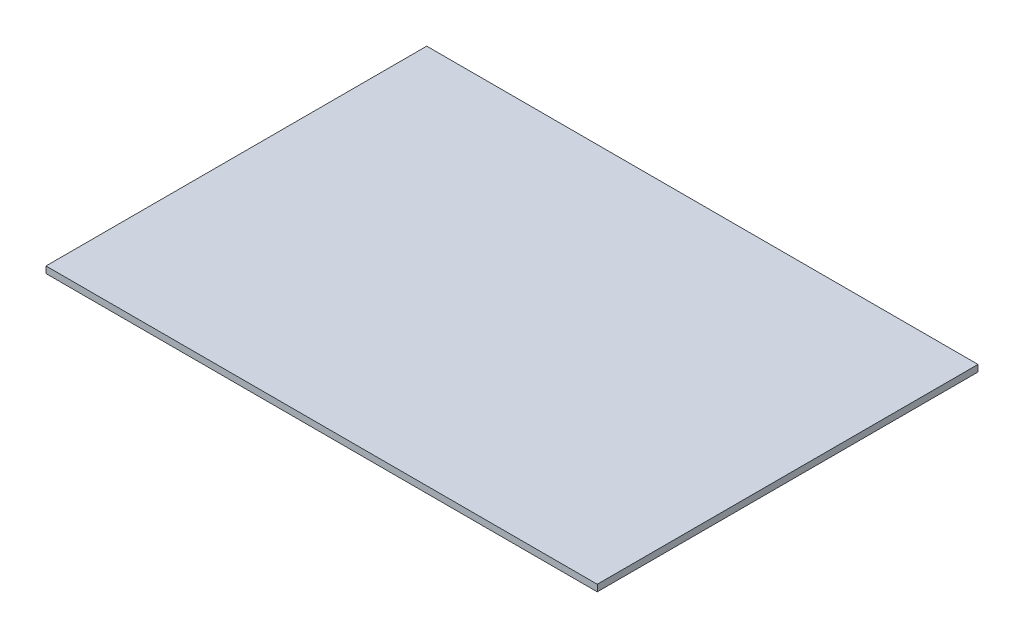
ISO-10303-21;
HEADER;
FILE_DESCRIPTION(('STEP AP214'),'2;1');
FILE_NAME('part.step','',(''),(''),'','','');
FILE_SCHEMA(('AUTOMOTIVE_DESIGN { 1 0 10303 214 1 1 1 1 }'));
ENDSEC;
DATA;
#1=APPLICATION_CONTEXT('core data for automotive mechanical design processes');
#2=APPLICATION_PROTOCOL_DEFINITION('international standard','automotive_design',2000,#1);
#3=PRODUCT_CONTEXT('',#1,'mechanical');
#4=PRODUCT('Part','Part','',(#3));
#5=PRODUCT_RELATED_PRODUCT_CATEGORY('part','',(#4));
#6=PRODUCT_DEFINITION_FORMATION('','',#4);
#7=PRODUCT_DEFINITION_CONTEXT('part definition',#1,'design');
#8=PRODUCT_DEFINITION('design','',#6,#7);
#9=PRODUCT_DEFINITION_SHAPE('','',#8);
#10=(LENGTH_UNIT() NAMED_UNIT(*) SI_UNIT(.MILLI.,.METRE.));
#11=(NAMED_UNIT(*) PLANE_ANGLE_UNIT() SI_UNIT($,.RADIAN.));
#12=(NAMED_UNIT(*) SI_UNIT($,.STERADIAN.) SOLID_ANGLE_UNIT());
#13=UNCERTAINTY_MEASURE_WITH_UNIT(LENGTH_MEASURE(1.E-05),#10,'distance_accuracy_value','');
#14=(GEOMETRIC_REPRESENTATION_CONTEXT(3) GLOBAL_UNCERTAINTY_ASSIGNED_CONTEXT((#13)) GLOBAL_UNIT_ASSIGNED_CONTEXT((#10,
#11,#12)) REPRESENTATION_CONTEXT('',''));
#15=CARTESIAN_POINT('',(0.,0.,0.));
#16=DIRECTION('',(0.,0.,1.));
#17=DIRECTION('',(1.,0.,0.));
#18=AXIS2_PLACEMENT_3D('',#15,#16,#17);
#19=CARTESIAN_POINT('',(750.,18.,-518.));
#20=DIRECTION('',(-1.,0.,0.));
#21=DIRECTION('',(0.,0.,1.));
#22=AXIS2_PLACEMENT_3D('',#19,#20,#21);
#23=PLANE('',#22);
#24=DIRECTION('',(0.,0.,-1.));
#25=VECTOR('',#24,1.);
#26=CARTESIAN_POINT('',(750.,0.,-518.));
#27=LINE('',#26,#25);
#28=CARTESIAN_POINT('',(750.,0.,518.));
#29=VERTEX_POINT('',#28);
#30=CARTESIAN_POINT('',(750.,0.,-518.));
#31=VERTEX_POINT('',#30);
#32=EDGE_CURVE('E96',#29,#31,#27,.T.);
#33=ORIENTED_EDGE('',*,*,#32,.T.);
#34=DIRECTION('',(0.,-1.,0.));
#35=VECTOR('',#34,1.);
#36=CARTESIAN_POINT('',(750.,18.,-518.));
#37=LINE('',#36,#35);
#38=CARTESIAN_POINT('',(750.,18.,-518.));
#39=VERTEX_POINT('',#38);
#40=EDGE_CURVE('E11',#39,#31,#37,.T.);
#41=ORIENTED_EDGE('',*,*,#40,.F.);
#42=DIRECTION('',(0.,0.,-1.));
#43=VECTOR('',#42,1.);
#44=CARTESIAN_POINT('',(750.,18.,-518.));
#45=LINE('',#44,#43);
#46=CARTESIAN_POINT('',(750.,18.,518.));
#47=VERTEX_POINT('',#46);
#48=EDGE_CURVE('E84',#47,#39,#45,.T.);
#49=ORIENTED_EDGE('',*,*,#48,.F.);
#50=DIRECTION('',(0.,-1.,0.));
#51=VECTOR('',#50,1.);
#52=CARTESIAN_POINT('',(750.,18.,518.));
#53=LINE('',#52,#51);
#54=EDGE_CURVE('E92',#47,#29,#53,.T.);
#55=ORIENTED_EDGE('',*,*,#54,.T.);
#56=EDGE_LOOP('',(#33,#41,#49,#55));
#57=FACE_BOUND('',#56,.T.);
#58=ADVANCED_FACE('F33',(#57),#23,.F.);
#59=CARTESIAN_POINT('',(-750.,18.,-518.));
#60=DIRECTION('',(0.,0.,1.));
#61=DIRECTION('',(1.,0.,0.));
#62=AXIS2_PLACEMENT_3D('',#59,#60,#61);
#63=PLANE('',#62);
#64=DIRECTION('',(-1.,0.,0.));
#65=VECTOR('',#64,1.);
#66=CARTESIAN_POINT('',(-750.,0.,-518.));
#67=LINE('',#66,#65);
#68=CARTESIAN_POINT('',(-750.,0.,-518.));
#69=VERTEX_POINT('',#68);
#70=EDGE_CURVE('E88',#31,#69,#67,.T.);
#71=ORIENTED_EDGE('',*,*,#70,.T.);
#72=DIRECTION('',(0.,-1.,0.));
#73=VECTOR('',#72,1.);
#74=CARTESIAN_POINT('',(-750.,18.,-518.));
#75=LINE('',#74,#73);
#76=CARTESIAN_POINT('',(-750.,18.,-518.));
#77=VERTEX_POINT('',#76);
#78=EDGE_CURVE('E41',#77,#69,#75,.T.);
#79=ORIENTED_EDGE('',*,*,#78,.F.);
#80=DIRECTION('',(-1.,0.,0.));
#81=VECTOR('',#80,1.);
#82=CARTESIAN_POINT('',(-750.,18.,-518.));
#83=LINE('',#82,#81);
#84=EDGE_CURVE('E79',#39,#77,#83,.T.);
#85=ORIENTED_EDGE('',*,*,#84,.F.);
#86=ORIENTED_EDGE('',*,*,#40,.T.);
#87=EDGE_LOOP('',(#71,#79,#85,#86));
#88=FACE_BOUND('',#87,.T.);
#89=ADVANCED_FACE('F87',(#88),#63,.F.);
#90=CARTESIAN_POINT('',(-750.,18.,-518.));
#91=DIRECTION('',(1.,0.,0.));
#92=DIRECTION('',(0.,0.,-1.));
#93=AXIS2_PLACEMENT_3D('',#90,#91,#92);
#94=PLANE('',#93);
#95=DIRECTION('',(0.,0.,1.));
#96=VECTOR('',#95,1.);
#97=CARTESIAN_POINT('',(-750.,0.,-518.));
#98=LINE('',#97,#96);
#99=CARTESIAN_POINT('',(-750.,0.,518.));
#100=VERTEX_POINT('',#99);
#101=EDGE_CURVE('E66',#69,#100,#98,.T.);
#102=ORIENTED_EDGE('',*,*,#101,.T.);
#103=DIRECTION('',(0.,-1.,0.));
#104=VECTOR('',#103,1.);
#105=CARTESIAN_POINT('',(-750.,18.,518.));
#106=LINE('',#105,#104);
#107=CARTESIAN_POINT('',(-750.,18.,518.));
#108=VERTEX_POINT('',#107);
#109=EDGE_CURVE('E89',#108,#100,#106,.T.);
#110=ORIENTED_EDGE('',*,*,#109,.F.);
#111=DIRECTION('',(0.,0.,1.));
#112=VECTOR('',#111,1.);
#113=CARTESIAN_POINT('',(-750.,18.,-518.));
#114=LINE('',#113,#112);
#115=EDGE_CURVE('E82',#77,#108,#114,.T.);
#116=ORIENTED_EDGE('',*,*,#115,.F.);
#117=ORIENTED_EDGE('',*,*,#78,.T.);
#118=EDGE_LOOP('',(#102,#110,#116,#117));
#119=FACE_BOUND('',#118,.T.);
#120=ADVANCED_FACE('F90',(#119),#94,.F.);
#121=CARTESIAN_POINT('',(-750.,18.,518.));
#122=DIRECTION('',(0.,0.,-1.));
#123=DIRECTION('',(-1.,0.,0.));
#124=AXIS2_PLACEMENT_3D('',#121,#122,#123);
#125=PLANE('',#124);
#126=DIRECTION('',(1.,0.,0.));
#127=VECTOR('',#126,1.);
#128=CARTESIAN_POINT('',(-750.,0.,518.));
#129=LINE('',#128,#127);
#130=EDGE_CURVE('E72',#100,#29,#129,.T.);
#131=ORIENTED_EDGE('',*,*,#130,.T.);
#132=ORIENTED_EDGE('',*,*,#54,.F.);
#133=DIRECTION('',(1.,0.,0.));
#134=VECTOR('',#133,1.);
#135=CARTESIAN_POINT('',(-750.,18.,518.));
#136=LINE('',#135,#134);
#137=EDGE_CURVE('E49',#108,#47,#136,.T.);
#138=ORIENTED_EDGE('',*,*,#137,.F.);
#139=ORIENTED_EDGE('',*,*,#109,.T.);
#140=EDGE_LOOP('',(#131,#132,#138,#139));
#141=FACE_BOUND('',#140,.T.);
#142=ADVANCED_FACE('F103',(#141),#125,.F.);
#143=CARTESIAN_POINT('',(0.,18.,0.));
#144=DIRECTION('',(0.,1.,0.));
#145=DIRECTION('',(0.,0.,1.));
#146=AXIS2_PLACEMENT_3D('',#143,#144,#145);
#147=PLANE('',#146);
#148=ORIENTED_EDGE('',*,*,#48,.T.);
#149=ORIENTED_EDGE('',*,*,#84,.T.);
#150=ORIENTED_EDGE('',*,*,#115,.T.);
#151=ORIENTED_EDGE('',*,*,#137,.T.);
#152=EDGE_LOOP('',(#148,#149,#150,#151));
#153=FACE_BOUND('',#152,.T.);
#154=ADVANCED_FACE('F80',(#153),#147,.T.);
#155=CARTESIAN_POINT('',(0.,0.,0.));
#156=DIRECTION('',(0.,1.,0.));
#157=DIRECTION('',(0.,0.,1.));
#158=AXIS2_PLACEMENT_3D('',#155,#156,#157);
#159=PLANE('',#158);
#160=ORIENTED_EDGE('',*,*,#32,.F.);
#161=ORIENTED_EDGE('',*,*,#130,.F.);
#162=ORIENTED_EDGE('',*,*,#101,.F.);
#163=ORIENTED_EDGE('',*,*,#70,.F.);
#164=EDGE_LOOP('',(#160,#161,#162,#163));
#165=FACE_BOUND('',#164,.T.);
#166=ADVANCED_FACE('F106',(#165),#159,.F.);
#167=CLOSED_SHELL('',(#58,#89,#120,#142,#154,#166));
#168=MANIFOLD_SOLID_BREP('B2',#167);
#169=ADVANCED_BREP_SHAPE_REPRESENTATION('',(#18,#168),#14);
#170=SHAPE_DEFINITION_REPRESENTATION(#9,#169);
ENDSEC;
END-ISO-10303-21;
